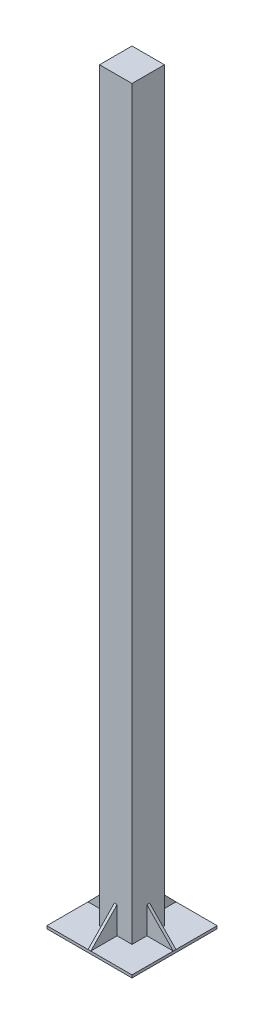
ISO-10303-21;
HEADER;
FILE_DESCRIPTION(('STEP AP214'),'2;1');
FILE_NAME('part.step','',(''),(''),'','','');
FILE_SCHEMA(('AUTOMOTIVE_DESIGN { 1 0 10303 214 1 1 1 1 }'));
ENDSEC;
DATA;
#1=APPLICATION_CONTEXT('core data for automotive mechanical design processes');
#2=APPLICATION_PROTOCOL_DEFINITION('international standard','automotive_design',2000,#1);
#3=PRODUCT_CONTEXT('',#1,'mechanical');
#4=PRODUCT('Part','Part','',(#3));
#5=PRODUCT_RELATED_PRODUCT_CATEGORY('part','',(#4));
#6=PRODUCT_DEFINITION_FORMATION('','',#4);
#7=PRODUCT_DEFINITION_CONTEXT('part definition',#1,'design');
#8=PRODUCT_DEFINITION('design','',#6,#7);
#9=PRODUCT_DEFINITION_SHAPE('','',#8);
#10=(LENGTH_UNIT() NAMED_UNIT(*) SI_UNIT(.MILLI.,.METRE.));
#11=(NAMED_UNIT(*) PLANE_ANGLE_UNIT() SI_UNIT($,.RADIAN.));
#12=(NAMED_UNIT(*) SI_UNIT($,.STERADIAN.) SOLID_ANGLE_UNIT());
#13=UNCERTAINTY_MEASURE_WITH_UNIT(LENGTH_MEASURE(1.E-05),#10,'distance_accuracy_value','');
#14=(GEOMETRIC_REPRESENTATION_CONTEXT(3) GLOBAL_UNCERTAINTY_ASSIGNED_CONTEXT((#13)) GLOBAL_UNIT_ASSIGNED_CONTEXT((#10,
#11,#12)) REPRESENTATION_CONTEXT('',''));
#15=CARTESIAN_POINT('',(0.,0.,0.));
#16=DIRECTION('',(0.,0.,1.));
#17=DIRECTION('',(1.,0.,0.));
#18=AXIS2_PLACEMENT_3D('',#15,#16,#17);
#19=CARTESIAN_POINT('',(0.,12.7,0.));
#20=DIRECTION('',(0.,-1.,0.));
#21=DIRECTION('',(0.,0.,-1.));
#22=AXIS2_PLACEMENT_3D('',#19,#20,#21);
#23=PLANE('',#22);
#24=DIRECTION('',(0.,0.,-1.));
#25=VECTOR('',#24,1.);
#26=CARTESIAN_POINT('',(6.35000000000004,12.7,200.));
#27=LINE('',#26,#25);
#28=CARTESIAN_POINT('',(6.35000000000004,12.7,200.));
#29=VERTEX_POINT('',#28);
#30=CARTESIAN_POINT('',(6.35000000000006,12.7,76.2000000000002));
#31=VERTEX_POINT('',#30);
#32=EDGE_CURVE('E255',#29,#31,#27,.T.);
#33=ORIENTED_EDGE('',*,*,#32,.F.);
#34=DIRECTION('',(1.,0.,0.));
#35=VECTOR('',#34,1.);
#36=CARTESIAN_POINT('',(-200.,12.7,200.));
#37=LINE('',#36,#35);
#38=CARTESIAN_POINT('',(200.,12.7,200.));
#39=VERTEX_POINT('',#38);
#40=EDGE_CURVE('E217',#29,#39,#37,.T.);
#41=ORIENTED_EDGE('',*,*,#40,.T.);
#42=DIRECTION('',(0.,0.,-1.));
#43=VECTOR('',#42,1.);
#44=CARTESIAN_POINT('',(200.,12.7,200.));
#45=LINE('',#44,#43);
#46=CARTESIAN_POINT('',(200.,12.7,6.35));
#47=VERTEX_POINT('',#46);
#48=EDGE_CURVE('E202',#39,#47,#45,.T.);
#49=ORIENTED_EDGE('',*,*,#48,.T.);
#50=DIRECTION('',(1.,0.,0.));
#51=VECTOR('',#50,1.);
#52=CARTESIAN_POINT('',(200.,12.7,6.35));
#53=LINE('',#52,#51);
#54=CARTESIAN_POINT('',(76.2,12.7,6.35000000000002));
#55=VERTEX_POINT('',#54);
#56=EDGE_CURVE('E198',#55,#47,#53,.T.);
#57=ORIENTED_EDGE('',*,*,#56,.F.);
#58=DIRECTION('',(0.,0.,-1.));
#59=VECTOR('',#58,1.);
#60=CARTESIAN_POINT('',(76.2,12.7,76.2));
#61=LINE('',#60,#59);
#62=CARTESIAN_POINT('',(76.2,12.7,76.2));
#63=VERTEX_POINT('',#62);
#64=EDGE_CURVE('E323',#63,#55,#61,.T.);
#65=ORIENTED_EDGE('',*,*,#64,.F.);
#66=DIRECTION('',(1.,0.,0.));
#67=VECTOR('',#66,1.);
#68=CARTESIAN_POINT('',(-76.2,12.7,76.2));
#69=LINE('',#68,#67);
#70=EDGE_CURVE('E333',#31,#63,#69,.T.);
#71=ORIENTED_EDGE('',*,*,#70,.F.);
#72=EDGE_LOOP('',(#33,#41,#49,#57,#65,#71));
#73=FACE_BOUND('',#72,.T.);
#74=ADVANCED_FACE('F33',(#73),#23,.F.);
#75=DIRECTION('',(0.,0.,1.));
#76=VECTOR('',#75,1.);
#77=CARTESIAN_POINT('',(-6.34999999999996,12.7,200.));
#78=LINE('',#77,#76);
#79=CARTESIAN_POINT('',(-6.34999999999995,12.7,76.2000000000002));
#80=VERTEX_POINT('',#79);
#81=CARTESIAN_POINT('',(-6.34999999999995,12.7,200.));
#82=VERTEX_POINT('',#81);
#83=EDGE_CURVE('E265',#80,#82,#78,.T.);
#84=ORIENTED_EDGE('',*,*,#83,.F.);
#85=CARTESIAN_POINT('',(-76.2,12.7,76.2));
#86=VERTEX_POINT('',#85);
#87=EDGE_CURVE('E316',#86,#80,#69,.T.);
#88=ORIENTED_EDGE('',*,*,#87,.F.);
#89=DIRECTION('',(0.,0.,1.));
#90=VECTOR('',#89,1.);
#91=CARTESIAN_POINT('',(-76.2,12.7,76.2));
#92=LINE('',#91,#90);
#93=CARTESIAN_POINT('',(-76.2,12.7,6.35));
#94=VERTEX_POINT('',#93);
#95=EDGE_CURVE('E329',#94,#86,#92,.T.);
#96=ORIENTED_EDGE('',*,*,#95,.F.);
#97=DIRECTION('',(1.,0.,0.));
#98=VECTOR('',#97,1.);
#99=CARTESIAN_POINT('',(-200.,12.7,6.34999999999992));
#100=LINE('',#99,#98);
#101=CARTESIAN_POINT('',(-200.,12.7,6.35000000000005));
#102=VERTEX_POINT('',#101);
#103=EDGE_CURVE('E294',#102,#94,#100,.T.);
#104=ORIENTED_EDGE('',*,*,#103,.F.);
#105=DIRECTION('',(0.,0.,1.));
#106=VECTOR('',#105,1.);
#107=CARTESIAN_POINT('',(-200.,12.7,200.));
#108=LINE('',#107,#106);
#109=CARTESIAN_POINT('',(-200.,12.7,200.));
#110=VERTEX_POINT('',#109);
#111=EDGE_CURVE('E214',#102,#110,#108,.T.);
#112=ORIENTED_EDGE('',*,*,#111,.T.);
#113=EDGE_CURVE('E218',#110,#82,#37,.T.);
#114=ORIENTED_EDGE('',*,*,#113,.T.);
#115=EDGE_LOOP('',(#84,#88,#96,#104,#112,#114));
#116=FACE_BOUND('',#115,.T.);
#117=ADVANCED_FACE('F397',(#116),#23,.F.);
#118=CARTESIAN_POINT('',(-76.2,3512.7,76.2));
#119=DIRECTION('',(0.,0.,-1.));
#120=DIRECTION('',(-1.,0.,0.));
#121=AXIS2_PLACEMENT_3D('',#118,#119,#120);
#122=PLANE('',#121);
#123=DIRECTION('',(0.,-1.,0.));
#124=VECTOR('',#123,1.);
#125=CARTESIAN_POINT('',(6.35000000000006,139.7,76.2000000000002));
#126=LINE('',#125,#124);
#127=CARTESIAN_POINT('',(6.35000000000005,139.7,76.2));
#128=VERTEX_POINT('',#127);
#129=EDGE_CURVE('E278',#128,#31,#126,.T.);
#130=ORIENTED_EDGE('',*,*,#129,.T.);
#131=ORIENTED_EDGE('',*,*,#70,.T.);
#132=DIRECTION('',(0.,-1.,0.));
#133=VECTOR('',#132,1.);
#134=CARTESIAN_POINT('',(76.2,3512.7,76.2));
#135=LINE('',#134,#133);
#136=CARTESIAN_POINT('',(76.2,3512.7,76.2));
#137=VERTEX_POINT('',#136);
#138=EDGE_CURVE('E322',#137,#63,#135,.T.);
#139=ORIENTED_EDGE('',*,*,#138,.F.);
#140=DIRECTION('',(1.,0.,0.));
#141=VECTOR('',#140,1.);
#142=CARTESIAN_POINT('',(-76.2,3512.7,76.2));
#143=LINE('',#142,#141);
#144=CARTESIAN_POINT('',(-76.2,3512.7,76.2));
#145=VERTEX_POINT('',#144);
#146=EDGE_CURVE('E320',#145,#137,#143,.T.);
#147=ORIENTED_EDGE('',*,*,#146,.F.);
#148=DIRECTION('',(0.,-1.,0.));
#149=VECTOR('',#148,1.);
#150=CARTESIAN_POINT('',(-76.2,3512.7,76.2));
#151=LINE('',#150,#149);
#152=EDGE_CURVE('E337',#145,#86,#151,.T.);
#153=ORIENTED_EDGE('',*,*,#152,.T.);
#154=ORIENTED_EDGE('',*,*,#87,.T.);
#155=DIRECTION('',(0.,-1.,0.));
#156=VECTOR('',#155,1.);
#157=CARTESIAN_POINT('',(-6.34999999999995,139.7,76.2000000000002));
#158=LINE('',#157,#156);
#159=CARTESIAN_POINT('',(-6.34999999999996,139.7,76.2));
#160=VERTEX_POINT('',#159);
#161=EDGE_CURVE('E268',#160,#80,#158,.T.);
#162=ORIENTED_EDGE('',*,*,#161,.F.);
#163=DIRECTION('',(-1.,0.,0.));
#164=VECTOR('',#163,1.);
#165=CARTESIAN_POINT('',(6.35000000000006,139.7,76.2000000000002));
#166=LINE('',#165,#164);
#167=EDGE_CURVE('E272',#128,#160,#166,.T.);
#168=ORIENTED_EDGE('',*,*,#167,.F.);
#169=EDGE_LOOP('',(#130,#131,#139,#147,#153,#154,#162,#168));
#170=FACE_BOUND('',#169,.T.);
#171=ADVANCED_FACE('F402',(#170),#122,.F.);
#172=DIRECTION('',(0.,0.,1.));
#173=VECTOR('',#172,1.);
#174=CARTESIAN_POINT('',(-6.35000000000002,12.7,-200.));
#175=LINE('',#174,#173);
#176=CARTESIAN_POINT('',(-6.35000000000002,12.7,-200.));
#177=VERTEX_POINT('',#176);
#178=CARTESIAN_POINT('',(-6.35000000000004,12.7,-76.2));
#179=VERTEX_POINT('',#178);
#180=EDGE_CURVE('E281',#177,#179,#175,.T.);
#181=ORIENTED_EDGE('',*,*,#180,.F.);
#182=DIRECTION('',(-1.,0.,0.));
#183=VECTOR('',#182,1.);
#184=CARTESIAN_POINT('',(-200.,12.7,-200.));
#185=LINE('',#184,#183);
#186=CARTESIAN_POINT('',(-200.,12.7,-200.));
#187=VERTEX_POINT('',#186);
#188=EDGE_CURVE('E205',#177,#187,#185,.T.);
#189=ORIENTED_EDGE('',*,*,#188,.T.);
#190=CARTESIAN_POINT('',(-200.,12.7,-6.35000000000004));
#191=VERTEX_POINT('',#190);
#192=EDGE_CURVE('E215',#187,#191,#108,.T.);
#193=ORIENTED_EDGE('',*,*,#192,.T.);
#194=DIRECTION('',(-1.,0.,0.));
#195=VECTOR('',#194,1.);
#196=CARTESIAN_POINT('',(-200.,12.7,-6.35000000000008));
#197=LINE('',#196,#195);
#198=CARTESIAN_POINT('',(-76.2,12.7,-6.35));
#199=VERTEX_POINT('',#198);
#200=EDGE_CURVE('E298',#199,#191,#197,.T.);
#201=ORIENTED_EDGE('',*,*,#200,.F.);
#202=CARTESIAN_POINT('',(-76.2,12.7,-76.2));
#203=VERTEX_POINT('',#202);
#204=EDGE_CURVE('E330',#203,#199,#92,.T.);
#205=ORIENTED_EDGE('',*,*,#204,.F.);
#206=DIRECTION('',(-1.,0.,0.));
#207=VECTOR('',#206,1.);
#208=CARTESIAN_POINT('',(-76.2,12.7,-76.2));
#209=LINE('',#208,#207);
#210=EDGE_CURVE('E325',#179,#203,#209,.T.);
#211=ORIENTED_EDGE('',*,*,#210,.F.);
#212=EDGE_LOOP('',(#181,#189,#193,#201,#205,#211));
#213=FACE_BOUND('',#212,.T.);
#214=ADVANCED_FACE('F364',(#213),#23,.F.);
#215=DIRECTION('',(0.,0.,-1.));
#216=VECTOR('',#215,1.);
#217=CARTESIAN_POINT('',(6.34999999999999,12.7,-200.));
#218=LINE('',#217,#216);
#219=CARTESIAN_POINT('',(6.34999999999997,12.7,-76.2));
#220=VERTEX_POINT('',#219);
#221=CARTESIAN_POINT('',(6.34999999999999,12.7,-200.));
#222=VERTEX_POINT('',#221);
#223=EDGE_CURVE('E285',#220,#222,#218,.T.);
#224=ORIENTED_EDGE('',*,*,#223,.F.);
#225=CARTESIAN_POINT('',(76.2,12.7,-76.2));
#226=VERTEX_POINT('',#225);
#227=EDGE_CURVE('E326',#226,#220,#209,.T.);
#228=ORIENTED_EDGE('',*,*,#227,.F.);
#229=CARTESIAN_POINT('',(76.2,12.7,-6.34999999999997));
#230=VERTEX_POINT('',#229);
#231=EDGE_CURVE('E196',#230,#226,#61,.T.);
#232=ORIENTED_EDGE('',*,*,#231,.F.);
#233=DIRECTION('',(-1.,0.,0.));
#234=VECTOR('',#233,1.);
#235=CARTESIAN_POINT('',(200.,12.7,-6.35));
#236=LINE('',#235,#234);
#237=CARTESIAN_POINT('',(200.,12.7,-6.35));
#238=VERTEX_POINT('',#237);
#239=EDGE_CURVE('E187',#238,#230,#236,.T.);
#240=ORIENTED_EDGE('',*,*,#239,.F.);
#241=CARTESIAN_POINT('',(200.,12.7,-200.));
#242=VERTEX_POINT('',#241);
#243=EDGE_CURVE('E193',#238,#242,#45,.T.);
#244=ORIENTED_EDGE('',*,*,#243,.T.);
#245=EDGE_CURVE('E212',#242,#222,#185,.T.);
#246=ORIENTED_EDGE('',*,*,#245,.T.);
#247=EDGE_LOOP('',(#224,#228,#232,#240,#244,#246));
#248=FACE_BOUND('',#247,.T.);
#249=ADVANCED_FACE('F192',(#248),#23,.F.);
#250=CARTESIAN_POINT('',(-76.2,3512.7,-76.2));
#251=DIRECTION('',(0.,0.,1.));
#252=DIRECTION('',(1.,0.,0.));
#253=AXIS2_PLACEMENT_3D('',#250,#251,#252);
#254=PLANE('',#253);
#255=DIRECTION('',(0.,-1.,0.));
#256=VECTOR('',#255,1.);
#257=CARTESIAN_POINT('',(-6.35,139.7,-76.2000000000001));
#258=LINE('',#257,#256);
#259=CARTESIAN_POINT('',(-6.35000000000001,139.7,-76.2));
#260=VERTEX_POINT('',#259);
#261=EDGE_CURVE('E292',#260,#179,#258,.T.);
#262=ORIENTED_EDGE('',*,*,#261,.T.);
#263=ORIENTED_EDGE('',*,*,#210,.T.);
#264=DIRECTION('',(0.,-1.,0.));
#265=VECTOR('',#264,1.);
#266=CARTESIAN_POINT('',(-76.2,3512.7,-76.2));
#267=LINE('',#266,#265);
#268=CARTESIAN_POINT('',(-76.2,3512.7,-76.2));
#269=VERTEX_POINT('',#268);
#270=EDGE_CURVE('E339',#269,#203,#267,.T.);
#271=ORIENTED_EDGE('',*,*,#270,.F.);
#272=DIRECTION('',(-1.,0.,0.));
#273=VECTOR('',#272,1.);
#274=CARTESIAN_POINT('',(-76.2,3512.7,-76.2));
#275=LINE('',#274,#273);
#276=CARTESIAN_POINT('',(76.2,3512.7,-76.2));
#277=VERTEX_POINT('',#276);
#278=EDGE_CURVE('E315',#277,#269,#275,.T.);
#279=ORIENTED_EDGE('',*,*,#278,.F.);
#280=DIRECTION('',(0.,-1.,0.));
#281=VECTOR('',#280,1.);
#282=CARTESIAN_POINT('',(76.2,3512.7,-76.2));
#283=LINE('',#282,#281);
#284=EDGE_CURVE('E210',#277,#226,#283,.T.);
#285=ORIENTED_EDGE('',*,*,#284,.T.);
#286=ORIENTED_EDGE('',*,*,#227,.T.);
#287=DIRECTION('',(0.,-1.,0.));
#288=VECTOR('',#287,1.);
#289=CARTESIAN_POINT('',(6.35,139.7,-76.2000000000001));
#290=LINE('',#289,#288);
#291=CARTESIAN_POINT('',(6.35,139.7,-76.2));
#292=VERTEX_POINT('',#291);
#293=EDGE_CURVE('E284',#292,#220,#290,.T.);
#294=ORIENTED_EDGE('',*,*,#293,.F.);
#295=DIRECTION('',(1.,0.,0.));
#296=VECTOR('',#295,1.);
#297=CARTESIAN_POINT('',(6.35,139.7,-76.2000000000001));
#298=LINE('',#297,#296);
#299=EDGE_CURVE('E282',#260,#292,#298,.T.);
#300=ORIENTED_EDGE('',*,*,#299,.F.);
#301=EDGE_LOOP('',(#262,#263,#271,#279,#285,#286,#294,#300));
#302=FACE_BOUND('',#301,.T.);
#303=ADVANCED_FACE('F347',(#302),#254,.F.);
#304=CARTESIAN_POINT('',(-76.2,3512.7,76.2));
#305=DIRECTION('',(1.,0.,0.));
#306=DIRECTION('',(0.,0.,-1.));
#307=AXIS2_PLACEMENT_3D('',#304,#305,#306);
#308=PLANE('',#307);
#309=DIRECTION('',(0.,-1.,0.));
#310=VECTOR('',#309,1.);
#311=CARTESIAN_POINT('',(-76.2,139.7,6.35));
#312=LINE('',#311,#310);
#313=CARTESIAN_POINT('',(-76.2,139.7,6.34999999999999));
#314=VERTEX_POINT('',#313);
#315=EDGE_CURVE('E303',#314,#94,#312,.T.);
#316=ORIENTED_EDGE('',*,*,#315,.T.);
#317=ORIENTED_EDGE('',*,*,#95,.T.);
#318=ORIENTED_EDGE('',*,*,#152,.F.);
#319=DIRECTION('',(0.,0.,1.));
#320=VECTOR('',#319,1.);
#321=CARTESIAN_POINT('',(-76.2,3512.7,76.2));
#322=LINE('',#321,#320);
#323=EDGE_CURVE('E318',#269,#145,#322,.T.);
#324=ORIENTED_EDGE('',*,*,#323,.F.);
#325=ORIENTED_EDGE('',*,*,#270,.T.);
#326=ORIENTED_EDGE('',*,*,#204,.T.);
#327=DIRECTION('',(0.,-1.,0.));
#328=VECTOR('',#327,1.);
#329=CARTESIAN_POINT('',(-76.2,139.7,-6.35));
#330=LINE('',#329,#328);
#331=CARTESIAN_POINT('',(-76.2,139.7,-6.35000000000008));
#332=VERTEX_POINT('',#331);
#333=EDGE_CURVE('E297',#332,#199,#330,.T.);
#334=ORIENTED_EDGE('',*,*,#333,.F.);
#335=DIRECTION('',(0.,0.,-1.));
#336=VECTOR('',#335,1.);
#337=CARTESIAN_POINT('',(-76.2,139.7,-6.35));
#338=LINE('',#337,#336);
#339=EDGE_CURVE('E295',#314,#332,#338,.T.);
#340=ORIENTED_EDGE('',*,*,#339,.F.);
#341=EDGE_LOOP('',(#316,#317,#318,#324,#325,#326,#334,#340));
#342=FACE_BOUND('',#341,.T.);
#343=ADVANCED_FACE('F389',(#342),#308,.F.);
#344=CARTESIAN_POINT('',(76.2,3512.7,76.2));
#345=DIRECTION('',(-1.,0.,0.));
#346=DIRECTION('',(0.,0.,1.));
#347=AXIS2_PLACEMENT_3D('',#344,#345,#346);
#348=PLANE('',#347);
#349=DIRECTION('',(0.,-1.,0.));
#350=VECTOR('',#349,1.);
#351=CARTESIAN_POINT('',(76.2,139.7,6.35));
#352=LINE('',#351,#350);
#353=CARTESIAN_POINT('',(76.2,139.7,6.35));
#354=VERTEX_POINT('',#353);
#355=EDGE_CURVE('E309',#354,#55,#352,.T.);
#356=ORIENTED_EDGE('',*,*,#355,.F.);
#357=DIRECTION('',(0.,0.,1.));
#358=VECTOR('',#357,1.);
#359=CARTESIAN_POINT('',(76.2,139.7,-6.35));
#360=LINE('',#359,#358);
#361=CARTESIAN_POINT('',(76.2,139.7,-6.34999999999999));
#362=VERTEX_POINT('',#361);
#363=EDGE_CURVE('E197',#362,#354,#360,.T.);
#364=ORIENTED_EDGE('',*,*,#363,.F.);
#365=DIRECTION('',(0.,-1.,0.));
#366=VECTOR('',#365,1.);
#367=CARTESIAN_POINT('',(76.2,139.7,-6.35));
#368=LINE('',#367,#366);
#369=EDGE_CURVE('E188',#362,#230,#368,.T.);
#370=ORIENTED_EDGE('',*,*,#369,.T.);
#371=ORIENTED_EDGE('',*,*,#231,.T.);
#372=ORIENTED_EDGE('',*,*,#284,.F.);
#373=DIRECTION('',(0.,0.,-1.));
#374=VECTOR('',#373,1.);
#375=CARTESIAN_POINT('',(76.2,3512.7,76.2));
#376=LINE('',#375,#374);
#377=EDGE_CURVE('E312',#137,#277,#376,.T.);
#378=ORIENTED_EDGE('',*,*,#377,.F.);
#379=ORIENTED_EDGE('',*,*,#138,.T.);
#380=ORIENTED_EDGE('',*,*,#64,.T.);
#381=EDGE_LOOP('',(#356,#364,#370,#371,#372,#378,#379,#380));
#382=FACE_BOUND('',#381,.T.);
#383=ADVANCED_FACE('F352',(#382),#348,.F.);
#384=CARTESIAN_POINT('',(200.,12.7,200.));
#385=DIRECTION('',(-1.,0.,0.));
#386=DIRECTION('',(0.,0.,1.));
#387=AXIS2_PLACEMENT_3D('',#384,#385,#386);
#388=PLANE('',#387);
#389=ORIENTED_EDGE('',*,*,#243,.F.);
#390=DIRECTION('',(0.,0.,-1.));
#391=VECTOR('',#390,1.);
#392=CARTESIAN_POINT('',(200.,12.7,6.65));
#393=LINE('',#392,#391);
#394=EDGE_CURVE('E170',#47,#238,#393,.T.);
#395=ORIENTED_EDGE('',*,*,#394,.F.);
#396=ORIENTED_EDGE('',*,*,#48,.F.);
#397=DIRECTION('',(0.,-1.,0.));
#398=VECTOR('',#397,1.);
#399=CARTESIAN_POINT('',(200.,12.7,200.));
#400=LINE('',#399,#398);
#401=CARTESIAN_POINT('',(200.,0.,200.));
#402=VERTEX_POINT('',#401);
#403=EDGE_CURVE('E220',#39,#402,#400,.T.);
#404=ORIENTED_EDGE('',*,*,#403,.T.);
#405=DIRECTION('',(0.,0.,-1.));
#406=VECTOR('',#405,1.);
#407=CARTESIAN_POINT('',(200.,0.,200.));
#408=LINE('',#407,#406);
#409=CARTESIAN_POINT('',(200.,0.,-200.));
#410=VERTEX_POINT('',#409);
#411=EDGE_CURVE('E221',#402,#410,#408,.T.);
#412=ORIENTED_EDGE('',*,*,#411,.T.);
#413=DIRECTION('',(0.,-1.,0.));
#414=VECTOR('',#413,1.);
#415=CARTESIAN_POINT('',(200.,12.7,-200.));
#416=LINE('',#415,#414);
#417=EDGE_CURVE('E11',#242,#410,#416,.T.);
#418=ORIENTED_EDGE('',*,*,#417,.F.);
#419=EDGE_LOOP('',(#389,#395,#396,#404,#412,#418));
#420=FACE_BOUND('',#419,.T.);
#421=ADVANCED_FACE('F35',(#420),#388,.F.);
#422=CARTESIAN_POINT('',(-200.,12.7,-200.));
#423=DIRECTION('',(0.,0.,1.));
#424=DIRECTION('',(1.,0.,0.));
#425=AXIS2_PLACEMENT_3D('',#422,#423,#424);
#426=PLANE('',#425);
#427=ORIENTED_EDGE('',*,*,#188,.F.);
#428=DIRECTION('',(-1.,0.,0.));
#429=VECTOR('',#428,1.);
#430=CARTESIAN_POINT('',(6.64999999999998,12.7,-200.));
#431=LINE('',#430,#429);
#432=EDGE_CURVE('E368',#222,#177,#431,.T.);
#433=ORIENTED_EDGE('',*,*,#432,.F.);
#434=ORIENTED_EDGE('',*,*,#245,.F.);
#435=ORIENTED_EDGE('',*,*,#417,.T.);
#436=DIRECTION('',(-1.,0.,0.));
#437=VECTOR('',#436,1.);
#438=CARTESIAN_POINT('',(-200.,0.,-200.));
#439=LINE('',#438,#437);
#440=CARTESIAN_POINT('',(-200.,0.,-200.));
#441=VERTEX_POINT('',#440);
#442=EDGE_CURVE('E223',#410,#441,#439,.T.);
#443=ORIENTED_EDGE('',*,*,#442,.T.);
#444=DIRECTION('',(0.,-1.,0.));
#445=VECTOR('',#444,1.);
#446=CARTESIAN_POINT('',(-200.,12.7,-200.));
#447=LINE('',#446,#445);
#448=EDGE_CURVE('E41',#187,#441,#447,.T.);
#449=ORIENTED_EDGE('',*,*,#448,.F.);
#450=EDGE_LOOP('',(#427,#433,#434,#435,#443,#449));
#451=FACE_BOUND('',#450,.T.);
#452=ADVANCED_FACE('F367',(#451),#426,.F.);
#453=CARTESIAN_POINT('',(-200.,12.7,200.));
#454=DIRECTION('',(1.,0.,0.));
#455=DIRECTION('',(0.,0.,-1.));
#456=AXIS2_PLACEMENT_3D('',#453,#454,#455);
#457=PLANE('',#456);
#458=ORIENTED_EDGE('',*,*,#111,.F.);
#459=DIRECTION('',(0.,0.,1.));
#460=VECTOR('',#459,1.);
#461=CARTESIAN_POINT('',(-200.,12.7,-6.64999999999995));
#462=LINE('',#461,#460);
#463=EDGE_CURVE('E376',#191,#102,#462,.T.);
#464=ORIENTED_EDGE('',*,*,#463,.F.);
#465=ORIENTED_EDGE('',*,*,#192,.F.);
#466=ORIENTED_EDGE('',*,*,#448,.T.);
#467=DIRECTION('',(0.,0.,1.));
#468=VECTOR('',#467,1.);
#469=CARTESIAN_POINT('',(-200.,0.,200.));
#470=LINE('',#469,#468);
#471=CARTESIAN_POINT('',(-200.,0.,200.));
#472=VERTEX_POINT('',#471);
#473=EDGE_CURVE('E206',#441,#472,#470,.T.);
#474=ORIENTED_EDGE('',*,*,#473,.T.);
#475=DIRECTION('',(0.,-1.,0.));
#476=VECTOR('',#475,1.);
#477=CARTESIAN_POINT('',(-200.,12.7,200.));
#478=LINE('',#477,#476);
#479=EDGE_CURVE('E228',#110,#472,#478,.T.);
#480=ORIENTED_EDGE('',*,*,#479,.F.);
#481=EDGE_LOOP('',(#458,#464,#465,#466,#474,#480));
#482=FACE_BOUND('',#481,.T.);
#483=ADVANCED_FACE('F236',(#482),#457,.F.);
#484=CARTESIAN_POINT('',(-200.,12.7,200.));
#485=DIRECTION('',(0.,0.,-1.));
#486=DIRECTION('',(-1.,0.,0.));
#487=AXIS2_PLACEMENT_3D('',#484,#485,#486);
#488=PLANE('',#487);
#489=ORIENTED_EDGE('',*,*,#40,.F.);
#490=DIRECTION('',(1.,0.,0.));
#491=VECTOR('',#490,1.);
#492=CARTESIAN_POINT('',(-6.64999999999996,12.7,200.));
#493=LINE('',#492,#491);
#494=EDGE_CURVE('E257',#82,#29,#493,.T.);
#495=ORIENTED_EDGE('',*,*,#494,.F.);
#496=ORIENTED_EDGE('',*,*,#113,.F.);
#497=ORIENTED_EDGE('',*,*,#479,.T.);
#498=DIRECTION('',(1.,0.,0.));
#499=VECTOR('',#498,1.);
#500=CARTESIAN_POINT('',(-200.,0.,200.));
#501=LINE('',#500,#499);
#502=EDGE_CURVE('E203',#472,#402,#501,.T.);
#503=ORIENTED_EDGE('',*,*,#502,.T.);
#504=ORIENTED_EDGE('',*,*,#403,.F.);
#505=EDGE_LOOP('',(#489,#495,#496,#497,#503,#504));
#506=FACE_BOUND('',#505,.T.);
#507=ADVANCED_FACE('F248',(#506),#488,.F.);
#508=CARTESIAN_POINT('',(0.,0.,0.));
#509=DIRECTION('',(0.,-1.,0.));
#510=DIRECTION('',(0.,0.,-1.));
#511=AXIS2_PLACEMENT_3D('',#508,#509,#510);
#512=PLANE('',#511);
#513=ORIENTED_EDGE('',*,*,#411,.F.);
#514=ORIENTED_EDGE('',*,*,#502,.F.);
#515=ORIENTED_EDGE('',*,*,#473,.F.);
#516=ORIENTED_EDGE('',*,*,#442,.F.);
#517=EDGE_LOOP('',(#513,#514,#515,#516));
#518=FACE_BOUND('',#517,.T.);
#519=ADVANCED_FACE('F244',(#518),#512,.T.);
#520=CARTESIAN_POINT('',(0.,3512.7,0.));
#521=DIRECTION('',(0.,-1.,0.));
#522=DIRECTION('',(0.,0.,-1.));
#523=AXIS2_PLACEMENT_3D('',#520,#521,#522);
#524=PLANE('',#523);
#525=ORIENTED_EDGE('',*,*,#377,.T.);
#526=ORIENTED_EDGE('',*,*,#278,.T.);
#527=ORIENTED_EDGE('',*,*,#323,.T.);
#528=ORIENTED_EDGE('',*,*,#146,.T.);
#529=EDGE_LOOP('',(#525,#526,#527,#528));
#530=FACE_BOUND('',#529,.T.);
#531=ADVANCED_FACE('F404',(#530),#524,.F.);
#532=CARTESIAN_POINT('',(200.,139.7,6.35));
#533=DIRECTION('',(0.,0.,-1.));
#534=DIRECTION('',(-1.,0.,0.));
#535=AXIS2_PLACEMENT_3D('',#532,#533,#534);
#536=PLANE('',#535);
#537=ORIENTED_EDGE('',*,*,#56,.T.);
#538=DIRECTION('',(-0.698027869182529,0.716070592780138,0.));
#539=VECTOR('',#538,1.);
#540=CARTESIAN_POINT('',(136.520671782051,77.8201509182513,6.35));
#541=LINE('',#540,#539);
#542=EDGE_CURVE('E176',#47,#354,#541,.T.);
#543=ORIENTED_EDGE('',*,*,#542,.T.);
#544=ORIENTED_EDGE('',*,*,#355,.T.);
#545=EDGE_LOOP('',(#537,#543,#544));
#546=FACE_BOUND('',#545,.T.);
#547=ADVANCED_FACE('F406',(#546),#536,.F.);
#548=CARTESIAN_POINT('',(200.,139.7,-6.35));
#549=DIRECTION('',(0.,0.,1.));
#550=DIRECTION('',(1.,0.,0.));
#551=AXIS2_PLACEMENT_3D('',#548,#549,#550);
#552=PLANE('',#551);
#553=ORIENTED_EDGE('',*,*,#369,.F.);
#554=DIRECTION('',(-0.698027869182529,0.716070592780138,0.));
#555=VECTOR('',#554,1.);
#556=CARTESIAN_POINT('',(76.2,139.7,-6.35));
#557=LINE('',#556,#555);
#558=EDGE_CURVE('E173',#238,#362,#557,.T.);
#559=ORIENTED_EDGE('',*,*,#558,.F.);
#560=ORIENTED_EDGE('',*,*,#239,.T.);
#561=EDGE_LOOP('',(#553,#559,#560));
#562=FACE_BOUND('',#561,.T.);
#563=ADVANCED_FACE('F186',(#562),#552,.F.);
#564=CARTESIAN_POINT('',(-200.,139.7,6.34999999999992));
#565=DIRECTION('',(0.,0.,-1.));
#566=DIRECTION('',(-1.,0.,0.));
#567=AXIS2_PLACEMENT_3D('',#564,#565,#566);
#568=PLANE('',#567);
#569=ORIENTED_EDGE('',*,*,#315,.F.);
#570=DIRECTION('',(0.698027869182529,0.716070592780138,0.));
#571=VECTOR('',#570,1.);
#572=CARTESIAN_POINT('',(-200.,12.7,6.35000000000005));
#573=LINE('',#572,#571);
#574=EDGE_CURVE('E370',#102,#314,#573,.T.);
#575=ORIENTED_EDGE('',*,*,#574,.F.);
#576=ORIENTED_EDGE('',*,*,#103,.T.);
#577=EDGE_LOOP('',(#569,#575,#576));
#578=FACE_BOUND('',#577,.T.);
#579=ADVANCED_FACE('F396',(#578),#568,.F.);
#580=CARTESIAN_POINT('',(-200.,139.7,-6.35000000000008));
#581=DIRECTION('',(0.,0.,1.));
#582=DIRECTION('',(1.,0.,0.));
#583=AXIS2_PLACEMENT_3D('',#580,#581,#582);
#584=PLANE('',#583);
#585=ORIENTED_EDGE('',*,*,#200,.T.);
#586=DIRECTION('',(0.698027869182529,0.716070592780138,0.));
#587=VECTOR('',#586,1.);
#588=CARTESIAN_POINT('',(-136.520671782051,77.8201509182513,-6.35000000000004));
#589=LINE('',#588,#587);
#590=EDGE_CURVE('E378',#191,#332,#589,.T.);
#591=ORIENTED_EDGE('',*,*,#590,.T.);
#592=ORIENTED_EDGE('',*,*,#333,.T.);
#593=EDGE_LOOP('',(#585,#591,#592));
#594=FACE_BOUND('',#593,.T.);
#595=ADVANCED_FACE('F385',(#594),#584,.F.);
#596=CARTESIAN_POINT('',(-6.35000000000002,139.7,-200.));
#597=DIRECTION('',(1.,0.,0.));
#598=DIRECTION('',(0.,0.,-1.));
#599=AXIS2_PLACEMENT_3D('',#596,#597,#598);
#600=PLANE('',#599);
#601=ORIENTED_EDGE('',*,*,#261,.F.);
#602=DIRECTION('',(0.,0.716070592780138,0.698027869182529));
#603=VECTOR('',#602,1.);
#604=CARTESIAN_POINT('',(-6.35,139.7,-76.2));
#605=LINE('',#604,#603);
#606=EDGE_CURVE('E56',#177,#260,#605,.T.);
#607=ORIENTED_EDGE('',*,*,#606,.F.);
#608=ORIENTED_EDGE('',*,*,#180,.T.);
#609=EDGE_LOOP('',(#601,#607,#608));
#610=FACE_BOUND('',#609,.T.);
#611=ADVANCED_FACE('F361',(#610),#600,.F.);
#612=CARTESIAN_POINT('',(6.34999999999999,139.7,-200.));
#613=DIRECTION('',(-1.,0.,0.));
#614=DIRECTION('',(0.,0.,1.));
#615=AXIS2_PLACEMENT_3D('',#612,#613,#614);
#616=PLANE('',#615);
#617=ORIENTED_EDGE('',*,*,#223,.T.);
#618=DIRECTION('',(0.,0.716070592780138,0.698027869182529));
#619=VECTOR('',#618,1.);
#620=CARTESIAN_POINT('',(6.34999999999999,77.8201509182512,-136.520671782051));
#621=LINE('',#620,#619);
#622=EDGE_CURVE('E357',#222,#292,#621,.T.);
#623=ORIENTED_EDGE('',*,*,#622,.T.);
#624=ORIENTED_EDGE('',*,*,#293,.T.);
#625=EDGE_LOOP('',(#617,#623,#624));
#626=FACE_BOUND('',#625,.T.);
#627=ADVANCED_FACE('F356',(#626),#616,.F.);
#628=CARTESIAN_POINT('',(6.35000000000004,139.7,200.));
#629=DIRECTION('',(-1.,0.,0.));
#630=DIRECTION('',(0.,0.,1.));
#631=AXIS2_PLACEMENT_3D('',#628,#629,#630);
#632=PLANE('',#631);
#633=ORIENTED_EDGE('',*,*,#129,.F.);
#634=DIRECTION('',(0.,0.716070592780138,-0.698027869182529));
#635=VECTOR('',#634,1.);
#636=CARTESIAN_POINT('',(6.35000000000004,12.7,200.));
#637=LINE('',#636,#635);
#638=EDGE_CURVE('E48',#29,#128,#637,.T.);
#639=ORIENTED_EDGE('',*,*,#638,.F.);
#640=ORIENTED_EDGE('',*,*,#32,.T.);
#641=EDGE_LOOP('',(#633,#639,#640));
#642=FACE_BOUND('',#641,.T.);
#643=ADVANCED_FACE('F554',(#642),#632,.F.);
#644=CARTESIAN_POINT('',(-6.34999999999996,139.7,200.));
#645=DIRECTION('',(1.,0.,0.));
#646=DIRECTION('',(0.,0.,-1.));
#647=AXIS2_PLACEMENT_3D('',#644,#645,#646);
#648=PLANE('',#647);
#649=ORIENTED_EDGE('',*,*,#83,.T.);
#650=DIRECTION('',(0.,0.716070592780138,-0.698027869182529));
#651=VECTOR('',#650,1.);
#652=CARTESIAN_POINT('',(-6.34999999999995,77.8201509182512,136.520671782051));
#653=LINE('',#652,#651);
#654=EDGE_CURVE('E260',#82,#160,#653,.T.);
#655=ORIENTED_EDGE('',*,*,#654,.T.);
#656=ORIENTED_EDGE('',*,*,#161,.T.);
#657=EDGE_LOOP('',(#649,#655,#656));
#658=FACE_BOUND('',#657,.T.);
#659=ADVANCED_FACE('F266',(#658),#648,.F.);
#660=CARTESIAN_POINT('',(-6.64999999999996,12.7,200.));
#661=DIRECTION('',(0.,-0.698027869182529,-0.716070592780138));
#662=DIRECTION('',(0.,0.716070592780138,-0.698027869182529));
#663=AXIS2_PLACEMENT_3D('',#660,#661,#662);
#664=PLANE('',#663);
#665=ORIENTED_EDGE('',*,*,#494,.T.);
#666=ORIENTED_EDGE('',*,*,#638,.T.);
#667=ORIENTED_EDGE('',*,*,#167,.T.);
#668=ORIENTED_EDGE('',*,*,#654,.F.);
#669=EDGE_LOOP('',(#665,#666,#667,#668));
#670=FACE_BOUND('',#669,.T.);
#671=ADVANCED_FACE('F569',(#670),#664,.F.);
#672=CARTESIAN_POINT('',(-200.,12.7,-6.64999999999995));
#673=DIRECTION('',(0.716070592780138,-0.698027869182529,0.));
#674=DIRECTION('',(0.698027869182529,0.716070592780138,0.));
#675=AXIS2_PLACEMENT_3D('',#672,#673,#674);
#676=PLANE('',#675);
#677=ORIENTED_EDGE('',*,*,#463,.T.);
#678=ORIENTED_EDGE('',*,*,#574,.T.);
#679=ORIENTED_EDGE('',*,*,#339,.T.);
#680=ORIENTED_EDGE('',*,*,#590,.F.);
#681=EDGE_LOOP('',(#677,#678,#679,#680));
#682=FACE_BOUND('',#681,.T.);
#683=ADVANCED_FACE('F392',(#682),#676,.F.);
#684=CARTESIAN_POINT('',(6.65,139.7,-76.2));
#685=DIRECTION('',(0.,-0.698027869182529,0.716070592780138));
#686=DIRECTION('',(0.,-0.716070592780138,-0.698027869182529));
#687=AXIS2_PLACEMENT_3D('',#684,#685,#686);
#688=PLANE('',#687);
#689=ORIENTED_EDGE('',*,*,#432,.T.);
#690=ORIENTED_EDGE('',*,*,#606,.T.);
#691=ORIENTED_EDGE('',*,*,#299,.T.);
#692=ORIENTED_EDGE('',*,*,#622,.F.);
#693=EDGE_LOOP('',(#689,#690,#691,#692));
#694=FACE_BOUND('',#693,.T.);
#695=ADVANCED_FACE('F582',(#694),#688,.F.);
#696=CARTESIAN_POINT('',(76.2,139.7,6.65));
#697=DIRECTION('',(-0.716070592780138,-0.698027869182529,0.));
#698=DIRECTION('',(0.698027869182529,-0.716070592780138,0.));
#699=AXIS2_PLACEMENT_3D('',#696,#697,#698);
#700=PLANE('',#699);
#701=ORIENTED_EDGE('',*,*,#394,.T.);
#702=ORIENTED_EDGE('',*,*,#558,.T.);
#703=ORIENTED_EDGE('',*,*,#363,.T.);
#704=ORIENTED_EDGE('',*,*,#542,.F.);
#705=EDGE_LOOP('',(#701,#702,#703,#704));
#706=FACE_BOUND('',#705,.T.);
#707=ADVANCED_FACE('F172',(#706),#700,.F.);
#708=CLOSED_SHELL('',(#74,#117,#171,#214,#249,#303,#343,#383,#421,#452,#483,#507,#519,#531,#547,
#563,#579,#595,#611,#627,#643,#659,#671,#683,#695,#707));
#709=MANIFOLD_SOLID_BREP('B2',#708);
#710=ADVANCED_BREP_SHAPE_REPRESENTATION('',(#18,#709),#14);
#711=SHAPE_DEFINITION_REPRESENTATION(#9,#710);
ENDSEC;
END-ISO-10303-21;
